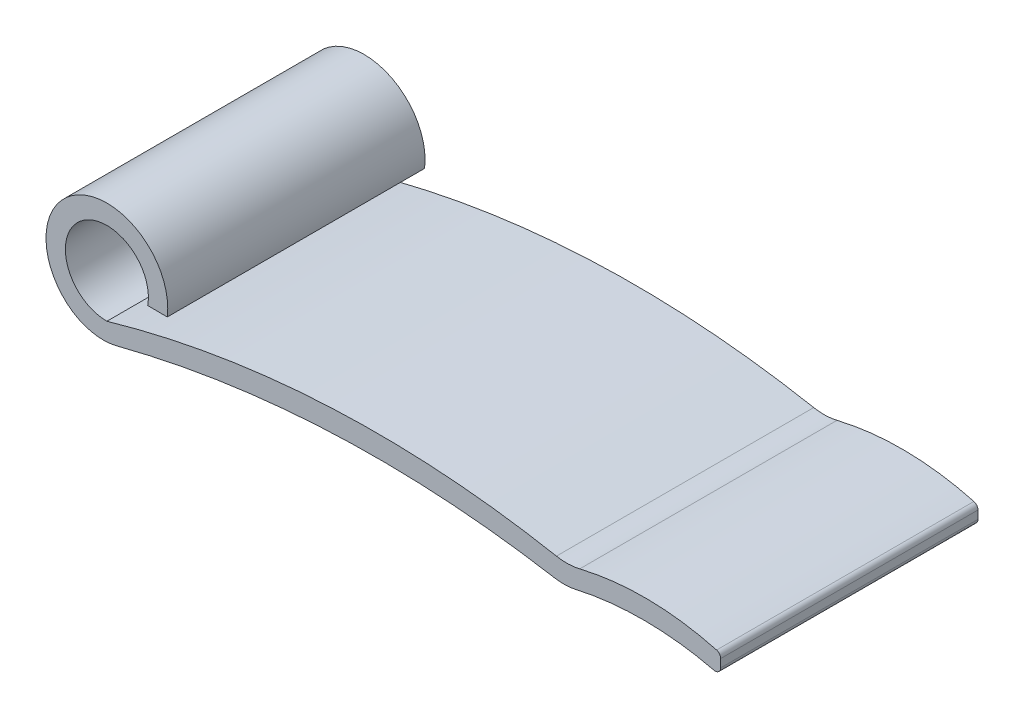
ISO-10303-21;
HEADER;
FILE_DESCRIPTION(('STEP AP214'),'2;1');
FILE_NAME('part.step','',(''),(''),'','','');
FILE_SCHEMA(('AUTOMOTIVE_DESIGN { 1 0 10303 214 1 1 1 1 }'));
ENDSEC;
DATA;
#1=APPLICATION_CONTEXT('core data for automotive mechanical design processes');
#2=APPLICATION_PROTOCOL_DEFINITION('international standard','automotive_design',2000,#1);
#3=PRODUCT_CONTEXT('',#1,'mechanical');
#4=PRODUCT('Part','Part','',(#3));
#5=PRODUCT_RELATED_PRODUCT_CATEGORY('part','',(#4));
#6=PRODUCT_DEFINITION_FORMATION('','',#4);
#7=PRODUCT_DEFINITION_CONTEXT('part definition',#1,'design');
#8=PRODUCT_DEFINITION('design','',#6,#7);
#9=PRODUCT_DEFINITION_SHAPE('','',#8);
#10=(LENGTH_UNIT() NAMED_UNIT(*) SI_UNIT(.MILLI.,.METRE.));
#11=(NAMED_UNIT(*) PLANE_ANGLE_UNIT() SI_UNIT($,.RADIAN.));
#12=(NAMED_UNIT(*) SI_UNIT($,.STERADIAN.) SOLID_ANGLE_UNIT());
#13=UNCERTAINTY_MEASURE_WITH_UNIT(LENGTH_MEASURE(1.E-05),#10,'distance_accuracy_value','');
#14=(GEOMETRIC_REPRESENTATION_CONTEXT(3) GLOBAL_UNCERTAINTY_ASSIGNED_CONTEXT((#13)) GLOBAL_UNIT_ASSIGNED_CONTEXT((#10,
#11,#12)) REPRESENTATION_CONTEXT('',''));
#15=CARTESIAN_POINT('',(0.,0.,0.));
#16=DIRECTION('',(0.,0.,1.));
#17=DIRECTION('',(1.,0.,0.));
#18=AXIS2_PLACEMENT_3D('',#15,#16,#17);
#19=CARTESIAN_POINT('',(12.3719166666667,-44.5985378950147,11.811));
#20=DIRECTION('',(0.,0.,-1.));
#21=DIRECTION('',(-1.,0.,0.));
#22=AXIS2_PLACEMENT_3D('',#19,#20,#21);
#23=CYLINDRICAL_SURFACE('',#22,44.45);
#24=CARTESIAN_POINT('',(12.3719166666667,-44.5985378950147,11.811));
#25=DIRECTION('',(0.,0.,1.));
#26=DIRECTION('',(-1.,0.,0.));
#27=AXIS2_PLACEMENT_3D('',#24,#25,#26);
#28=CIRCLE('',#27,44.45);
#29=CARTESIAN_POINT('',(20.6361282854688,-0.923541543330172,11.811));
#30=VERTEX_POINT('',#29);
#31=CARTESIAN_POINT('',(0.,-1.905,11.811));
#32=VERTEX_POINT('',#31);
#33=EDGE_CURVE('E128',#30,#32,#28,.T.);
#34=ORIENTED_EDGE('',*,*,#33,.F.);
#35=DIRECTION('',(0.,0.,-1.));
#36=VECTOR('',#35,1.);
#37=CARTESIAN_POINT('',(20.6361282854688,-0.923541543330172,11.811));
#38=LINE('',#37,#36);
#39=CARTESIAN_POINT('',(20.6361282854688,-0.923541543330172,0.));
#40=VERTEX_POINT('',#39);
#41=EDGE_CURVE('E176',#30,#40,#38,.T.);
#42=ORIENTED_EDGE('',*,*,#41,.T.);
#43=CARTESIAN_POINT('',(12.3719166666667,-44.5985378950147,0.));
#44=DIRECTION('',(0.,0.,1.));
#45=DIRECTION('',(-1.,0.,0.));
#46=AXIS2_PLACEMENT_3D('',#43,#44,#45);
#47=CIRCLE('',#46,44.45);
#48=CARTESIAN_POINT('',(0.,-1.905,0.));
#49=VERTEX_POINT('',#48);
#50=EDGE_CURVE('E151',#40,#49,#47,.T.);
#51=ORIENTED_EDGE('',*,*,#50,.T.);
#52=DIRECTION('',(0.,0.,-1.));
#53=VECTOR('',#52,1.);
#54=CARTESIAN_POINT('',(0.,-1.905,11.811));
#55=LINE('',#54,#53);
#56=EDGE_CURVE('E144',#32,#49,#55,.T.);
#57=ORIENTED_EDGE('',*,*,#56,.F.);
#58=EDGE_LOOP('',(#34,#42,#51,#57));
#59=FACE_BOUND('',#58,.T.);
#60=ADVANCED_FACE('F32',(#59),#23,.T.);
#61=CARTESIAN_POINT('',(0.,0.,11.811));
#62=DIRECTION('',(0.,0.,-1.));
#63=DIRECTION('',(-1.,0.,0.));
#64=AXIS2_PLACEMENT_3D('',#61,#62,#63);
#65=CYLINDRICAL_SURFACE('',#64,1.905);
#66=CARTESIAN_POINT('',(0.,0.,0.));
#67=DIRECTION('',(0.,0.,-1.));
#68=DIRECTION('',(-1.,0.,0.));
#69=AXIS2_PLACEMENT_3D('',#66,#67,#68);
#70=CIRCLE('',#69,1.905);
#71=CARTESIAN_POINT('',(1.87407121214458,-0.34188023021368,0.));
#72=VERTEX_POINT('',#71);
#73=EDGE_CURVE('E234',#49,#72,#70,.T.);
#74=ORIENTED_EDGE('',*,*,#73,.T.);
#75=DIRECTION('',(0.,0.,-1.));
#76=VECTOR('',#75,1.);
#77=CARTESIAN_POINT('',(1.87407121214458,-0.34188023021368,11.811));
#78=LINE('',#77,#76);
#79=CARTESIAN_POINT('',(1.87407121214458,-0.34188023021368,11.811));
#80=VERTEX_POINT('',#79);
#81=EDGE_CURVE('E146',#80,#72,#78,.T.);
#82=ORIENTED_EDGE('',*,*,#81,.F.);
#83=CARTESIAN_POINT('',(0.,0.,11.811));
#84=DIRECTION('',(0.,0.,-1.));
#85=DIRECTION('',(-1.,0.,0.));
#86=AXIS2_PLACEMENT_3D('',#83,#84,#85);
#87=CIRCLE('',#86,1.905);
#88=EDGE_CURVE('E131',#32,#80,#87,.T.);
#89=ORIENTED_EDGE('',*,*,#88,.F.);
#90=ORIENTED_EDGE('',*,*,#56,.T.);
#91=EDGE_LOOP('',(#74,#82,#89,#90));
#92=FACE_BOUND('',#91,.T.);
#93=ADVANCED_FACE('F143',(#92),#65,.F.);
#94=CARTESIAN_POINT('',(1.87407121214458,-0.341880230213682,11.811));
#95=DIRECTION('',(0.0089863101438299,0.99995962229982,0.));
#96=DIRECTION('',(-0.99995962229982,0.0089863101438299,0.));
#97=AXIS2_PLACEMENT_3D('',#94,#95,#96);
#98=PLANE('',#97);
#99=DIRECTION('',(0.99995962229982,-0.0089863101438299,0.));
#100=VECTOR('',#99,1.);
#101=CARTESIAN_POINT('',(1.87407121214458,-0.341880230213682,0.));
#102=LINE('',#101,#100);
#103=CARTESIAN_POINT('',(2.77267248721607,-0.349955666034642,0.));
#104=VERTEX_POINT('',#103);
#105=EDGE_CURVE('E236',#72,#104,#102,.T.);
#106=ORIENTED_EDGE('',*,*,#105,.T.);
#107=DIRECTION('',(0.,0.,-1.));
#108=VECTOR('',#107,1.);
#109=CARTESIAN_POINT('',(2.77267248721607,-0.349955666034642,11.811));
#110=LINE('',#109,#108);
#111=CARTESIAN_POINT('',(2.77267248721607,-0.349955666034642,11.811));
#112=VERTEX_POINT('',#111);
#113=EDGE_CURVE('E158',#112,#104,#110,.T.);
#114=ORIENTED_EDGE('',*,*,#113,.F.);
#115=DIRECTION('',(0.99995962229982,-0.0089863101438299,0.));
#116=VECTOR('',#115,1.);
#117=CARTESIAN_POINT('',(1.87407121214458,-0.341880230213682,11.811));
#118=LINE('',#117,#116);
#119=EDGE_CURVE('E148',#80,#112,#118,.T.);
#120=ORIENTED_EDGE('',*,*,#119,.F.);
#121=ORIENTED_EDGE('',*,*,#81,.T.);
#122=EDGE_LOOP('',(#106,#114,#120,#121));
#123=FACE_BOUND('',#122,.T.);
#124=ADVANCED_FACE('F258',(#123),#98,.F.);
#125=CARTESIAN_POINT('',(0.,0.,11.811));
#126=DIRECTION('',(0.,0.,-1.));
#127=DIRECTION('',(-1.,0.,0.));
#128=AXIS2_PLACEMENT_3D('',#125,#126,#127);
#129=CYLINDRICAL_SURFACE('',#128,2.79467022912448);
#130=CARTESIAN_POINT('',(0.,0.,0.));
#131=DIRECTION('',(0.,0.,1.));
#132=DIRECTION('',(-1.,0.,0.));
#133=AXIS2_PLACEMENT_3D('',#130,#131,#132);
#134=CIRCLE('',#133,2.79467022912448);
#135=CARTESIAN_POINT('',(-1.80826461421184,-2.13081223352599,0.));
#136=VERTEX_POINT('',#135);
#137=EDGE_CURVE('E220',#104,#136,#134,.T.);
#138=ORIENTED_EDGE('',*,*,#137,.T.);
#139=DIRECTION('',(0.,0.,-1.));
#140=VECTOR('',#139,1.);
#141=CARTESIAN_POINT('',(-1.80826461421184,-2.13081223352599,11.811));
#142=LINE('',#141,#140);
#143=CARTESIAN_POINT('',(-1.80826461421184,-2.13081223352599,11.811));
#144=VERTEX_POINT('',#143);
#145=EDGE_CURVE('E163',#136,#144,#142,.F.);
#146=ORIENTED_EDGE('',*,*,#145,.T.);
#147=CARTESIAN_POINT('',(0.,0.,11.811));
#148=DIRECTION('',(0.,0.,1.));
#149=DIRECTION('',(-1.,0.,0.));
#150=AXIS2_PLACEMENT_3D('',#147,#148,#149);
#151=CIRCLE('',#150,2.79467022912448);
#152=EDGE_CURVE('E249',#112,#144,#151,.T.);
#153=ORIENTED_EDGE('',*,*,#152,.F.);
#154=ORIENTED_EDGE('',*,*,#113,.T.);
#155=EDGE_LOOP('',(#138,#146,#153,#154));
#156=FACE_BOUND('',#155,.T.);
#157=ADVANCED_FACE('F238',(#156),#129,.T.);
#158=CARTESIAN_POINT('',(12.4207844731182,-48.9362992190497,11.811));
#159=DIRECTION('',(0.,0.,-1.));
#160=DIRECTION('',(-1.,0.,0.));
#161=AXIS2_PLACEMENT_3D('',#158,#159,#160);
#162=CYLINDRICAL_SURFACE('',#161,47.800750668837);
#163=CARTESIAN_POINT('',(12.4207844731182,-48.9362992190497,0.));
#164=DIRECTION('',(0.,0.,-1.));
#165=DIRECTION('',(1.,0.,0.));
#166=AXIS2_PLACEMENT_3D('',#163,#164,#165);
#167=CIRCLE('',#166,47.800750668837);
#168=CARTESIAN_POINT('',(0.470237176307191,-2.65351425734935,0.));
#169=VERTEX_POINT('',#168);
#170=CARTESIAN_POINT('',(20.5387635086446,-1.82992830297225,0.));
#171=VERTEX_POINT('',#170);
#172=EDGE_CURVE('E216',#169,#171,#167,.T.);
#173=ORIENTED_EDGE('',*,*,#172,.T.);
#174=DIRECTION('',(0.,0.,-1.));
#175=VECTOR('',#174,1.);
#176=CARTESIAN_POINT('',(20.5387635086446,-1.82992830297225,11.811));
#177=LINE('',#176,#175);
#178=CARTESIAN_POINT('',(20.5387635086446,-1.82992830297225,11.811));
#179=VERTEX_POINT('',#178);
#180=EDGE_CURVE('E172',#171,#179,#177,.F.);
#181=ORIENTED_EDGE('',*,*,#180,.T.);
#182=CARTESIAN_POINT('',(12.4207844731182,-48.9362992190497,11.811));
#183=DIRECTION('',(0.,0.,-1.));
#184=DIRECTION('',(1.,0.,0.));
#185=AXIS2_PLACEMENT_3D('',#182,#183,#184);
#186=CIRCLE('',#185,47.800750668837);
#187=CARTESIAN_POINT('',(0.470237176307191,-2.65351425734935,11.811));
#188=VERTEX_POINT('',#187);
#189=EDGE_CURVE('E247',#188,#179,#186,.T.);
#190=ORIENTED_EDGE('',*,*,#189,.F.);
#191=DIRECTION('',(0.,0.,-1.));
#192=VECTOR('',#191,1.);
#193=CARTESIAN_POINT('',(0.470237176307188,-2.65351425734934,11.811));
#194=LINE('',#193,#192);
#195=EDGE_CURVE('E153',#188,#169,#194,.T.);
#196=ORIENTED_EDGE('',*,*,#195,.T.);
#197=EDGE_LOOP('',(#173,#181,#190,#196));
#198=FACE_BOUND('',#197,.T.);
#199=ADVANCED_FACE('F251',(#198),#162,.F.);
#200=CARTESIAN_POINT('',(24.6138562707506,-15.4657276482349,11.811));
#201=DIRECTION('',(0.,0.,-1.));
#202=DIRECTION('',(-1.,0.,0.));
#203=AXIS2_PLACEMENT_3D('',#200,#201,#202);
#204=CYLINDRICAL_SURFACE('',#203,14.0051168807447);
#205=CARTESIAN_POINT('',(24.6138562707506,-15.4657276482349,0.));
#206=DIRECTION('',(0.,0.,-1.));
#207=DIRECTION('',(1.,0.,0.));
#208=AXIS2_PLACEMENT_3D('',#205,#206,#207);
#209=CIRCLE('',#208,14.0051168807447);
#210=CARTESIAN_POINT('',(21.5295138965676,-1.80446376226375,0.));
#211=VERTEX_POINT('',#210);
#212=CARTESIAN_POINT('',(27.8631044578841,-1.84274394194904,0.));
#213=VERTEX_POINT('',#212);
#214=EDGE_CURVE('E212',#211,#213,#209,.T.);
#215=ORIENTED_EDGE('',*,*,#214,.T.);
#216=DIRECTION('',(0.,0.,-1.));
#217=VECTOR('',#216,1.);
#218=CARTESIAN_POINT('',(27.8631044578841,-1.84274394194904,11.811));
#219=LINE('',#218,#217);
#220=CARTESIAN_POINT('',(27.8631044578841,-1.84274394194904,11.811));
#221=VERTEX_POINT('',#220);
#222=EDGE_CURVE('E55',#213,#221,#219,.F.);
#223=ORIENTED_EDGE('',*,*,#222,.T.);
#224=CARTESIAN_POINT('',(24.6138562707506,-15.4657276482349,11.811));
#225=DIRECTION('',(0.,0.,-1.));
#226=DIRECTION('',(1.,0.,0.));
#227=AXIS2_PLACEMENT_3D('',#224,#225,#226);
#228=CIRCLE('',#227,14.0051168807447);
#229=CARTESIAN_POINT('',(21.5295138965676,-1.80446376226375,11.811));
#230=VERTEX_POINT('',#229);
#231=EDGE_CURVE('E198',#230,#221,#228,.T.);
#232=ORIENTED_EDGE('',*,*,#231,.F.);
#233=DIRECTION('',(0.,0.,-1.));
#234=VECTOR('',#233,1.);
#235=CARTESIAN_POINT('',(21.5295138965676,-1.80446376226375,11.811));
#236=LINE('',#235,#234);
#237=EDGE_CURVE('E167',#230,#211,#236,.T.);
#238=ORIENTED_EDGE('',*,*,#237,.T.);
#239=EDGE_LOOP('',(#215,#223,#232,#238));
#240=FACE_BOUND('',#239,.T.);
#241=ADVANCED_FACE('F214',(#240),#204,.F.);
#242=CARTESIAN_POINT('',(28.1760335654781,-1.03220138246066,11.811));
#243=DIRECTION('',(-1.,0.,0.));
#244=DIRECTION('',(0.,0.,1.));
#245=AXIS2_PLACEMENT_3D('',#242,#243,#244);
#246=PLANE('',#245);
#247=DIRECTION('',(0.,1.,0.));
#248=VECTOR('',#247,1.);
#249=CARTESIAN_POINT('',(28.1760335654781,-1.03220138246066,11.811));
#250=LINE('',#249,#248);
#251=CARTESIAN_POINT('',(28.1760335654781,-1.59567439652068,11.811));
#252=VERTEX_POINT('',#251);
#253=CARTESIAN_POINT('',(28.1760335654781,-1.22526242417547,11.811));
#254=VERTEX_POINT('',#253);
#255=EDGE_CURVE('E197',#252,#254,#250,.T.);
#256=ORIENTED_EDGE('',*,*,#255,.F.);
#257=DIRECTION('',(0.,0.,-1.));
#258=VECTOR('',#257,1.);
#259=CARTESIAN_POINT('',(28.1760335654781,-1.59567439652068,11.811));
#260=LINE('',#259,#258);
#261=CARTESIAN_POINT('',(28.1760335654781,-1.59567439652068,0.));
#262=VERTEX_POINT('',#261);
#263=EDGE_CURVE('E187',#252,#262,#260,.T.);
#264=ORIENTED_EDGE('',*,*,#263,.T.);
#265=DIRECTION('',(0.,1.,0.));
#266=VECTOR('',#265,1.);
#267=CARTESIAN_POINT('',(28.1760335654781,-1.03220138246066,0.));
#268=LINE('',#267,#266);
#269=CARTESIAN_POINT('',(28.1760335654781,-1.22526242417547,0.));
#270=VERTEX_POINT('',#269);
#271=EDGE_CURVE('E213',#262,#270,#268,.T.);
#272=ORIENTED_EDGE('',*,*,#271,.T.);
#273=DIRECTION('',(0.,0.,-1.));
#274=VECTOR('',#273,1.);
#275=CARTESIAN_POINT('',(28.1760335654781,-1.22526242417547,11.811));
#276=LINE('',#275,#274);
#277=EDGE_CURVE('E185',#270,#254,#276,.F.);
#278=ORIENTED_EDGE('',*,*,#277,.T.);
#279=EDGE_LOOP('',(#256,#264,#272,#278));
#280=FACE_BOUND('',#279,.T.);
#281=ADVANCED_FACE('F202',(#280),#246,.F.);
#282=CARTESIAN_POINT('',(24.6835335654782,-13.2425430545843,11.811));
#283=DIRECTION('',(0.,0.,-1.));
#284=DIRECTION('',(-1.,0.,0.));
#285=AXIS2_PLACEMENT_3D('',#282,#283,#284);
#286=CYLINDRICAL_SURFACE('',#285,12.7);
#287=CARTESIAN_POINT('',(24.6835335654782,-13.2425430545843,11.811));
#288=DIRECTION('',(0.,0.,1.));
#289=DIRECTION('',(-1.,0.,0.));
#290=AXIS2_PLACEMENT_3D('',#287,#288,#289);
#291=CIRCLE('',#290,12.7);
#292=CARTESIAN_POINT('',(27.9881254022128,-0.980011799065084,11.811));
#293=VERTEX_POINT('',#292);
#294=CARTESIAN_POINT('',(21.7042297187467,-0.896946730839942,11.811));
#295=VERTEX_POINT('',#294);
#296=EDGE_CURVE('E206',#293,#295,#291,.T.);
#297=ORIENTED_EDGE('',*,*,#296,.F.);
#298=DIRECTION('',(0.,0.,-1.));
#299=VECTOR('',#298,1.);
#300=CARTESIAN_POINT('',(27.9881254022128,-0.980011799065083,11.811));
#301=LINE('',#300,#299);
#302=CARTESIAN_POINT('',(27.9881254022128,-0.980011799065084,0.));
#303=VERTEX_POINT('',#302);
#304=EDGE_CURVE('E11',#293,#303,#301,.T.);
#305=ORIENTED_EDGE('',*,*,#304,.T.);
#306=CARTESIAN_POINT('',(24.6835335654782,-13.2425430545843,0.));
#307=DIRECTION('',(0.,0.,1.));
#308=DIRECTION('',(-1.,0.,0.));
#309=AXIS2_PLACEMENT_3D('',#306,#307,#308);
#310=CIRCLE('',#309,12.7);
#311=CARTESIAN_POINT('',(21.7042297187467,-0.896946730839942,0.));
#312=VERTEX_POINT('',#311);
#313=EDGE_CURVE('E139',#303,#312,#310,.T.);
#314=ORIENTED_EDGE('',*,*,#313,.T.);
#315=DIRECTION('',(0.,0.,-1.));
#316=VECTOR('',#315,1.);
#317=CARTESIAN_POINT('',(21.7042297187467,-0.89694673083994,11.811));
#318=LINE('',#317,#316);
#319=EDGE_CURVE('E178',#312,#295,#318,.F.);
#320=ORIENTED_EDGE('',*,*,#319,.T.);
#321=EDGE_LOOP('',(#297,#305,#314,#320));
#322=FACE_BOUND('',#321,.T.);
#323=ADVANCED_FACE('F264',(#322),#286,.T.);
#324=CARTESIAN_POINT('',(12.3719166666667,-44.5985378950147,11.811));
#325=DIRECTION('',(0.,0.,-1.));
#326=DIRECTION('',(-1.,0.,0.));
#327=AXIS2_PLACEMENT_3D('',#324,#325,#326);
#328=PLANE('',#327);
#329=ORIENTED_EDGE('',*,*,#231,.T.);
#330=CARTESIAN_POINT('',(27.9220335654781,-1.59567439652068,11.811));
#331=DIRECTION('',(0.,0.,-1.));
#332=DIRECTION('',(-1.,0.,0.));
#333=AXIS2_PLACEMENT_3D('',#330,#331,#332);
#334=CIRCLE('',#333,0.254);
#335=EDGE_CURVE('E40',#221,#252,#334,.F.);
#336=ORIENTED_EDGE('',*,*,#335,.T.);
#337=ORIENTED_EDGE('',*,*,#255,.T.);
#338=CARTESIAN_POINT('',(27.9220335654781,-1.22526242417547,11.811));
#339=DIRECTION('',(0.,0.,-1.));
#340=DIRECTION('',(-1.,0.,0.));
#341=AXIS2_PLACEMENT_3D('',#338,#339,#340);
#342=CIRCLE('',#341,0.254);
#343=EDGE_CURVE('E47',#254,#293,#342,.F.);
#344=ORIENTED_EDGE('',*,*,#343,.T.);
#345=ORIENTED_EDGE('',*,*,#296,.T.);
#346=CARTESIAN_POINT('',(21.1083689494004,1.57217253390895,11.811));
#347=DIRECTION('',(0.,0.,-1.));
#348=DIRECTION('',(-1.,0.,0.));
#349=AXIS2_PLACEMENT_3D('',#346,#347,#348);
#350=CIRCLE('',#349,2.54);
#351=EDGE_CURVE('E134',#295,#30,#350,.T.);
#352=ORIENTED_EDGE('',*,*,#351,.T.);
#353=ORIENTED_EDGE('',*,*,#33,.T.);
#354=ORIENTED_EDGE('',*,*,#88,.T.);
#355=ORIENTED_EDGE('',*,*,#119,.T.);
#356=ORIENTED_EDGE('',*,*,#152,.T.);
#357=CARTESIAN_POINT('',(-0.164781933417568,-0.194174766696555,11.811));
#358=DIRECTION('',(0.,0.,-1.));
#359=DIRECTION('',(-1.,0.,0.));
#360=AXIS2_PLACEMENT_3D('',#357,#358,#359);
#361=CIRCLE('',#360,2.54);
#362=EDGE_CURVE('E165',#144,#188,#361,.F.);
#363=ORIENTED_EDGE('',*,*,#362,.T.);
#364=ORIENTED_EDGE('',*,*,#189,.T.);
#365=CARTESIAN_POINT('',(20.9701305156837,0.673174272879987,11.811));
#366=DIRECTION('',(0.,0.,-1.));
#367=DIRECTION('',(-1.,0.,0.));
#368=AXIS2_PLACEMENT_3D('',#365,#366,#367);
#369=CIRCLE('',#368,2.54);
#370=EDGE_CURVE('E174',#179,#230,#369,.F.);
#371=ORIENTED_EDGE('',*,*,#370,.T.);
#372=EDGE_LOOP('',(#329,#336,#337,#344,#345,#352,#353,#354,#355,#356,#363,#364,#371));
#373=FACE_BOUND('',#372,.T.);
#374=ADVANCED_FACE('F130',(#373),#328,.F.);
#375=CARTESIAN_POINT('',(12.3719166666667,-44.5985378950147,0.));
#376=DIRECTION('',(0.,0.,-1.));
#377=DIRECTION('',(-1.,0.,0.));
#378=AXIS2_PLACEMENT_3D('',#375,#376,#377);
#379=PLANE('',#378);
#380=ORIENTED_EDGE('',*,*,#271,.F.);
#381=CARTESIAN_POINT('',(27.9220335654781,-1.59567439652068,0.));
#382=DIRECTION('',(0.,0.,-1.));
#383=DIRECTION('',(-1.,0.,0.));
#384=AXIS2_PLACEMENT_3D('',#381,#382,#383);
#385=CIRCLE('',#384,0.254);
#386=EDGE_CURVE('E192',#262,#213,#385,.T.);
#387=ORIENTED_EDGE('',*,*,#386,.T.);
#388=ORIENTED_EDGE('',*,*,#214,.F.);
#389=CARTESIAN_POINT('',(20.9701305156837,0.673174272879987,0.));
#390=DIRECTION('',(0.,0.,-1.));
#391=DIRECTION('',(-1.,0.,0.));
#392=AXIS2_PLACEMENT_3D('',#389,#390,#391);
#393=CIRCLE('',#392,2.54);
#394=EDGE_CURVE('E170',#211,#171,#393,.T.);
#395=ORIENTED_EDGE('',*,*,#394,.T.);
#396=ORIENTED_EDGE('',*,*,#172,.F.);
#397=CARTESIAN_POINT('',(-0.164781933417568,-0.194174766696555,0.));
#398=DIRECTION('',(0.,0.,-1.));
#399=DIRECTION('',(-1.,0.,0.));
#400=AXIS2_PLACEMENT_3D('',#397,#398,#399);
#401=CIRCLE('',#400,2.54);
#402=EDGE_CURVE('E156',#169,#136,#401,.T.);
#403=ORIENTED_EDGE('',*,*,#402,.T.);
#404=ORIENTED_EDGE('',*,*,#137,.F.);
#405=ORIENTED_EDGE('',*,*,#105,.F.);
#406=ORIENTED_EDGE('',*,*,#73,.F.);
#407=ORIENTED_EDGE('',*,*,#50,.F.);
#408=CARTESIAN_POINT('',(21.1083689494004,1.57217253390895,0.));
#409=DIRECTION('',(0.,0.,-1.));
#410=DIRECTION('',(-1.,0.,0.));
#411=AXIS2_PLACEMENT_3D('',#408,#409,#410);
#412=CIRCLE('',#411,2.54);
#413=EDGE_CURVE('E181',#40,#312,#412,.F.);
#414=ORIENTED_EDGE('',*,*,#413,.T.);
#415=ORIENTED_EDGE('',*,*,#313,.F.);
#416=CARTESIAN_POINT('',(27.9220335654781,-1.22526242417547,0.));
#417=DIRECTION('',(0.,0.,-1.));
#418=DIRECTION('',(-1.,0.,0.));
#419=AXIS2_PLACEMENT_3D('',#416,#417,#418);
#420=CIRCLE('',#419,0.254);
#421=EDGE_CURVE('E190',#303,#270,#420,.T.);
#422=ORIENTED_EDGE('',*,*,#421,.T.);
#423=EDGE_LOOP('',(#380,#387,#388,#395,#396,#403,#404,#405,#406,#407,#414,#415,#422));
#424=FACE_BOUND('',#423,.T.);
#425=ADVANCED_FACE('F211',(#424),#379,.T.);
#426=CARTESIAN_POINT('',(-0.164781933417568,-0.194174766696555,11.811));
#427=DIRECTION('',(0.,0.,1.));
#428=DIRECTION('',(1.,0.,0.));
#429=AXIS2_PLACEMENT_3D('',#426,#427,#428);
#430=CYLINDRICAL_SURFACE('',#429,2.54);
#431=ORIENTED_EDGE('',*,*,#362,.F.);
#432=ORIENTED_EDGE('',*,*,#145,.F.);
#433=ORIENTED_EDGE('',*,*,#402,.F.);
#434=ORIENTED_EDGE('',*,*,#195,.F.);
#435=EDGE_LOOP('',(#431,#432,#433,#434));
#436=FACE_BOUND('',#435,.T.);
#437=ADVANCED_FACE('F243',(#436),#430,.T.);
#438=CARTESIAN_POINT('',(20.9701305156837,0.673174272879987,11.811));
#439=DIRECTION('',(0.,0.,-1.));
#440=DIRECTION('',(-1.,0.,0.));
#441=AXIS2_PLACEMENT_3D('',#438,#439,#440);
#442=CYLINDRICAL_SURFACE('',#441,2.54);
#443=ORIENTED_EDGE('',*,*,#370,.F.);
#444=ORIENTED_EDGE('',*,*,#180,.F.);
#445=ORIENTED_EDGE('',*,*,#394,.F.);
#446=ORIENTED_EDGE('',*,*,#237,.F.);
#447=EDGE_LOOP('',(#443,#444,#445,#446));
#448=FACE_BOUND('',#447,.T.);
#449=ADVANCED_FACE('F281',(#448),#442,.T.);
#450=CARTESIAN_POINT('',(21.1083689494004,1.57217253390895,11.811));
#451=DIRECTION('',(0.,0.,1.));
#452=DIRECTION('',(1.,0.,0.));
#453=AXIS2_PLACEMENT_3D('',#450,#451,#452);
#454=CYLINDRICAL_SURFACE('',#453,2.54);
#455=ORIENTED_EDGE('',*,*,#351,.F.);
#456=ORIENTED_EDGE('',*,*,#319,.F.);
#457=ORIENTED_EDGE('',*,*,#413,.F.);
#458=ORIENTED_EDGE('',*,*,#41,.F.);
#459=EDGE_LOOP('',(#455,#456,#457,#458));
#460=FACE_BOUND('',#459,.T.);
#461=ADVANCED_FACE('F262',(#460),#454,.F.);
#462=CARTESIAN_POINT('',(27.9220335654781,-1.59567439652068,11.811));
#463=DIRECTION('',(0.,0.,-1.));
#464=DIRECTION('',(-1.,0.,0.));
#465=AXIS2_PLACEMENT_3D('',#462,#463,#464);
#466=CYLINDRICAL_SURFACE('',#465,0.254);
#467=ORIENTED_EDGE('',*,*,#335,.F.);
#468=ORIENTED_EDGE('',*,*,#222,.F.);
#469=ORIENTED_EDGE('',*,*,#386,.F.);
#470=ORIENTED_EDGE('',*,*,#263,.F.);
#471=EDGE_LOOP('',(#467,#468,#469,#470));
#472=FACE_BOUND('',#471,.T.);
#473=ADVANCED_FACE('F208',(#472),#466,.T.);
#474=CARTESIAN_POINT('',(27.9220335654781,-1.22526242417547,11.811));
#475=DIRECTION('',(0.,0.,-1.));
#476=DIRECTION('',(-1.,0.,0.));
#477=AXIS2_PLACEMENT_3D('',#474,#475,#476);
#478=CYLINDRICAL_SURFACE('',#477,0.254);
#479=ORIENTED_EDGE('',*,*,#343,.F.);
#480=ORIENTED_EDGE('',*,*,#277,.F.);
#481=ORIENTED_EDGE('',*,*,#421,.F.);
#482=ORIENTED_EDGE('',*,*,#304,.F.);
#483=EDGE_LOOP('',(#479,#480,#481,#482));
#484=FACE_BOUND('',#483,.T.);
#485=ADVANCED_FACE('F34',(#484),#478,.T.);
#486=CLOSED_SHELL('',(#60,#93,#124,#157,#199,#241,#281,#323,#374,#425,#437,#449,#461,#473,#485));
#487=MANIFOLD_SOLID_BREP('B2',#486);
#488=ADVANCED_BREP_SHAPE_REPRESENTATION('',(#18,#487),#14);
#489=SHAPE_DEFINITION_REPRESENTATION(#9,#488);
ENDSEC;
END-ISO-10303-21;
